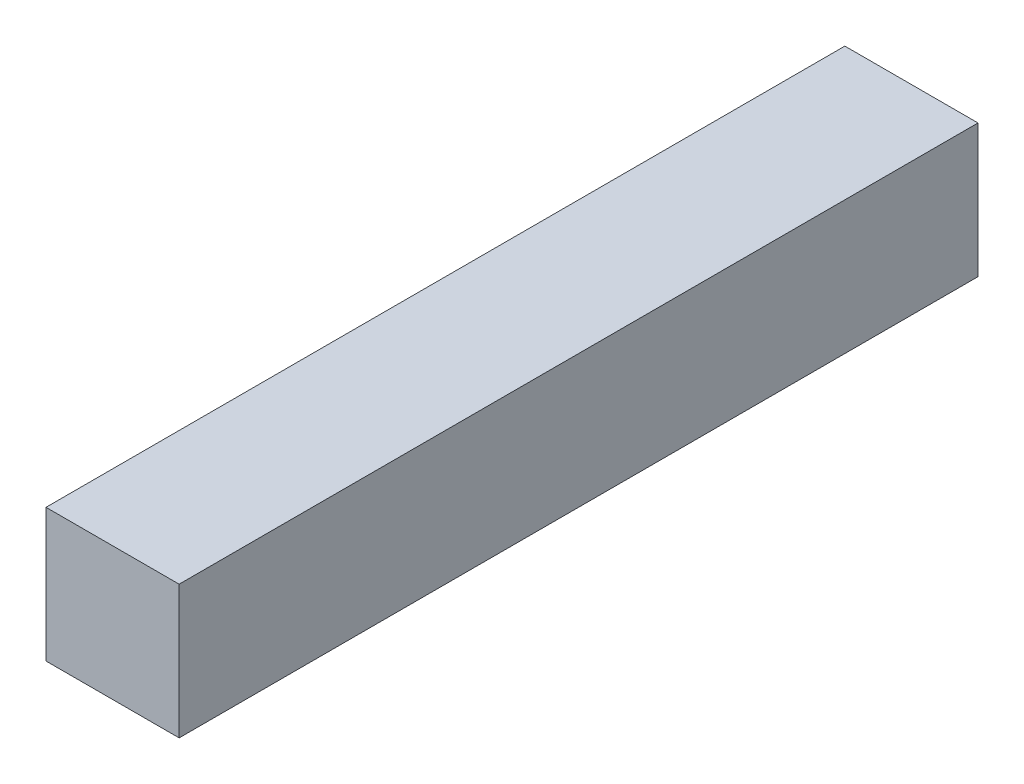
ISO-10303-21;
HEADER;
FILE_DESCRIPTION(('STEP AP214'),'2;1');
FILE_NAME('part.step','',(''),(''),'','','');
FILE_SCHEMA(('AUTOMOTIVE_DESIGN { 1 0 10303 214 1 1 1 1 }'));
ENDSEC;
DATA;
#1=APPLICATION_CONTEXT('core data for automotive mechanical design processes');
#2=APPLICATION_PROTOCOL_DEFINITION('international standard','automotive_design',2000,#1);
#3=PRODUCT_CONTEXT('',#1,'mechanical');
#4=PRODUCT('Part','Part','',(#3));
#5=PRODUCT_RELATED_PRODUCT_CATEGORY('part','',(#4));
#6=PRODUCT_DEFINITION_FORMATION('','',#4);
#7=PRODUCT_DEFINITION_CONTEXT('part definition',#1,'design');
#8=PRODUCT_DEFINITION('design','',#6,#7);
#9=PRODUCT_DEFINITION_SHAPE('','',#8);
#10=(LENGTH_UNIT() NAMED_UNIT(*) SI_UNIT(.MILLI.,.METRE.));
#11=(NAMED_UNIT(*) PLANE_ANGLE_UNIT() SI_UNIT($,.RADIAN.));
#12=(NAMED_UNIT(*) SI_UNIT($,.STERADIAN.) SOLID_ANGLE_UNIT());
#13=UNCERTAINTY_MEASURE_WITH_UNIT(LENGTH_MEASURE(1.E-05),#10,'distance_accuracy_value','');
#14=(GEOMETRIC_REPRESENTATION_CONTEXT(3) GLOBAL_UNCERTAINTY_ASSIGNED_CONTEXT((#13)) GLOBAL_UNIT_ASSIGNED_CONTEXT((#10,
#11,#12)) REPRESENTATION_CONTEXT('',''));
#15=CARTESIAN_POINT('',(0.,0.,0.));
#16=DIRECTION('',(0.,0.,1.));
#17=DIRECTION('',(1.,0.,0.));
#18=AXIS2_PLACEMENT_3D('',#15,#16,#17);
#19=CARTESIAN_POINT('',(1.5,-1.5,9.));
#20=DIRECTION('',(0.,1.,0.));
#21=DIRECTION('',(-1.,0.,0.));
#22=AXIS2_PLACEMENT_3D('',#19,#20,#21);
#23=PLANE('',#22);
#24=DIRECTION('',(0.,0.,-1.));
#25=VECTOR('',#24,1.);
#26=CARTESIAN_POINT('',(-1.5,-1.5,9.));
#27=LINE('',#26,#25);
#28=CARTESIAN_POINT('',(-1.5,-1.5,9.));
#29=VERTEX_POINT('',#28);
#30=CARTESIAN_POINT('',(-1.5,-1.5,-9.));
#31=VERTEX_POINT('',#30);
#32=EDGE_CURVE('E96',#29,#31,#27,.T.);
#33=ORIENTED_EDGE('',*,*,#32,.T.);
#34=DIRECTION('',(1.,0.,0.));
#35=VECTOR('',#34,1.);
#36=CARTESIAN_POINT('',(1.5,-1.5,-9.));
#37=LINE('',#36,#35);
#38=CARTESIAN_POINT('',(1.5,-1.5,-9.));
#39=VERTEX_POINT('',#38);
#40=EDGE_CURVE('E91',#31,#39,#37,.T.);
#41=ORIENTED_EDGE('',*,*,#40,.T.);
#42=DIRECTION('',(0.,0.,-1.));
#43=VECTOR('',#42,1.);
#44=CARTESIAN_POINT('',(1.5,-1.5,9.));
#45=LINE('',#44,#43);
#46=CARTESIAN_POINT('',(1.5,-1.5,9.));
#47=VERTEX_POINT('',#46);
#48=EDGE_CURVE('E11',#47,#39,#45,.T.);
#49=ORIENTED_EDGE('',*,*,#48,.F.);
#50=DIRECTION('',(1.,0.,0.));
#51=VECTOR('',#50,1.);
#52=CARTESIAN_POINT('',(1.5,-1.5,9.));
#53=LINE('',#52,#51);
#54=EDGE_CURVE('E102',#29,#47,#53,.T.);
#55=ORIENTED_EDGE('',*,*,#54,.F.);
#56=EDGE_LOOP('',(#33,#41,#49,#55));
#57=FACE_BOUND('',#56,.T.);
#58=ADVANCED_FACE('F39',(#57),#23,.F.);
#59=CARTESIAN_POINT('',(1.5,-1.5,9.));
#60=DIRECTION('',(-1.,0.,0.));
#61=DIRECTION('',(0.,0.,1.));
#62=AXIS2_PLACEMENT_3D('',#59,#60,#61);
#63=PLANE('',#62);
#64=ORIENTED_EDGE('',*,*,#48,.T.);
#65=DIRECTION('',(0.,1.,0.));
#66=VECTOR('',#65,1.);
#67=CARTESIAN_POINT('',(1.5,-1.5,-9.));
#68=LINE('',#67,#66);
#69=CARTESIAN_POINT('',(1.5,1.5,-9.));
#70=VERTEX_POINT('',#69);
#71=EDGE_CURVE('E81',#39,#70,#68,.T.);
#72=ORIENTED_EDGE('',*,*,#71,.T.);
#73=DIRECTION('',(0.,0.,-1.));
#74=VECTOR('',#73,1.);
#75=CARTESIAN_POINT('',(1.5,1.5,9.));
#76=LINE('',#75,#74);
#77=CARTESIAN_POINT('',(1.5,1.5,9.));
#78=VERTEX_POINT('',#77);
#79=EDGE_CURVE('E46',#78,#70,#76,.T.);
#80=ORIENTED_EDGE('',*,*,#79,.F.);
#81=DIRECTION('',(0.,1.,0.));
#82=VECTOR('',#81,1.);
#83=CARTESIAN_POINT('',(1.5,-1.5,9.));
#84=LINE('',#83,#82);
#85=EDGE_CURVE('E82',#47,#78,#84,.T.);
#86=ORIENTED_EDGE('',*,*,#85,.F.);
#87=EDGE_LOOP('',(#64,#72,#80,#86));
#88=FACE_BOUND('',#87,.T.);
#89=ADVANCED_FACE('F79',(#88),#63,.F.);
#90=CARTESIAN_POINT('',(1.5,1.5,9.));
#91=DIRECTION('',(0.,-1.,0.));
#92=DIRECTION('',(1.,0.,0.));
#93=AXIS2_PLACEMENT_3D('',#90,#91,#92);
#94=PLANE('',#93);
#95=ORIENTED_EDGE('',*,*,#79,.T.);
#96=DIRECTION('',(-1.,0.,0.));
#97=VECTOR('',#96,1.);
#98=CARTESIAN_POINT('',(1.5,1.5,-9.));
#99=LINE('',#98,#97);
#100=CARTESIAN_POINT('',(-1.5,1.5,-9.));
#101=VERTEX_POINT('',#100);
#102=EDGE_CURVE('E94',#70,#101,#99,.T.);
#103=ORIENTED_EDGE('',*,*,#102,.T.);
#104=DIRECTION('',(0.,0.,-1.));
#105=VECTOR('',#104,1.);
#106=CARTESIAN_POINT('',(-1.5,1.5,9.));
#107=LINE('',#106,#105);
#108=CARTESIAN_POINT('',(-1.5,1.5,9.));
#109=VERTEX_POINT('',#108);
#110=EDGE_CURVE('E108',#109,#101,#107,.T.);
#111=ORIENTED_EDGE('',*,*,#110,.F.);
#112=DIRECTION('',(-1.,0.,0.));
#113=VECTOR('',#112,1.);
#114=CARTESIAN_POINT('',(1.5,1.5,9.));
#115=LINE('',#114,#113);
#116=EDGE_CURVE('E58',#78,#109,#115,.T.);
#117=ORIENTED_EDGE('',*,*,#116,.F.);
#118=EDGE_LOOP('',(#95,#103,#111,#117));
#119=FACE_BOUND('',#118,.T.);
#120=ADVANCED_FACE('F110',(#119),#94,.F.);
#121=CARTESIAN_POINT('',(-1.5,-1.5,9.));
#122=DIRECTION('',(1.,0.,0.));
#123=DIRECTION('',(0.,0.,-1.));
#124=AXIS2_PLACEMENT_3D('',#121,#122,#123);
#125=PLANE('',#124);
#126=ORIENTED_EDGE('',*,*,#110,.T.);
#127=DIRECTION('',(0.,-1.,0.));
#128=VECTOR('',#127,1.);
#129=CARTESIAN_POINT('',(-1.5,-1.5,-9.));
#130=LINE('',#129,#128);
#131=EDGE_CURVE('E100',#101,#31,#130,.T.);
#132=ORIENTED_EDGE('',*,*,#131,.T.);
#133=ORIENTED_EDGE('',*,*,#32,.F.);
#134=DIRECTION('',(0.,-1.,0.));
#135=VECTOR('',#134,1.);
#136=CARTESIAN_POINT('',(-1.5,-1.5,9.));
#137=LINE('',#136,#135);
#138=EDGE_CURVE('E53',#109,#29,#137,.T.);
#139=ORIENTED_EDGE('',*,*,#138,.F.);
#140=EDGE_LOOP('',(#126,#132,#133,#139));
#141=FACE_BOUND('',#140,.T.);
#142=ADVANCED_FACE('F112',(#141),#125,.F.);
#143=CARTESIAN_POINT('',(0.,0.,9.));
#144=DIRECTION('',(0.,0.,-1.));
#145=DIRECTION('',(-1.,0.,0.));
#146=AXIS2_PLACEMENT_3D('',#143,#144,#145);
#147=PLANE('',#146);
#148=ORIENTED_EDGE('',*,*,#54,.T.);
#149=ORIENTED_EDGE('',*,*,#85,.T.);
#150=ORIENTED_EDGE('',*,*,#116,.T.);
#151=ORIENTED_EDGE('',*,*,#138,.T.);
#152=EDGE_LOOP('',(#148,#149,#150,#151));
#153=FACE_BOUND('',#152,.T.);
#154=ADVANCED_FACE('F113',(#153),#147,.F.);
#155=CARTESIAN_POINT('',(0.,0.,-9.));
#156=DIRECTION('',(0.,0.,-1.));
#157=DIRECTION('',(-1.,0.,0.));
#158=AXIS2_PLACEMENT_3D('',#155,#156,#157);
#159=PLANE('',#158);
#160=ORIENTED_EDGE('',*,*,#40,.F.);
#161=ORIENTED_EDGE('',*,*,#131,.F.);
#162=ORIENTED_EDGE('',*,*,#102,.F.);
#163=ORIENTED_EDGE('',*,*,#71,.F.);
#164=EDGE_LOOP('',(#160,#161,#162,#163));
#165=FACE_BOUND('',#164,.T.);
#166=ADVANCED_FACE('F89',(#165),#159,.T.);
#167=CLOSED_SHELL('',(#58,#89,#120,#142,#154,#166));
#168=MANIFOLD_SOLID_BREP('B2',#167);
#169=ADVANCED_BREP_SHAPE_REPRESENTATION('',(#18,#168),#14);
#170=SHAPE_DEFINITION_REPRESENTATION(#9,#169);
ENDSEC;
END-ISO-10303-21;
